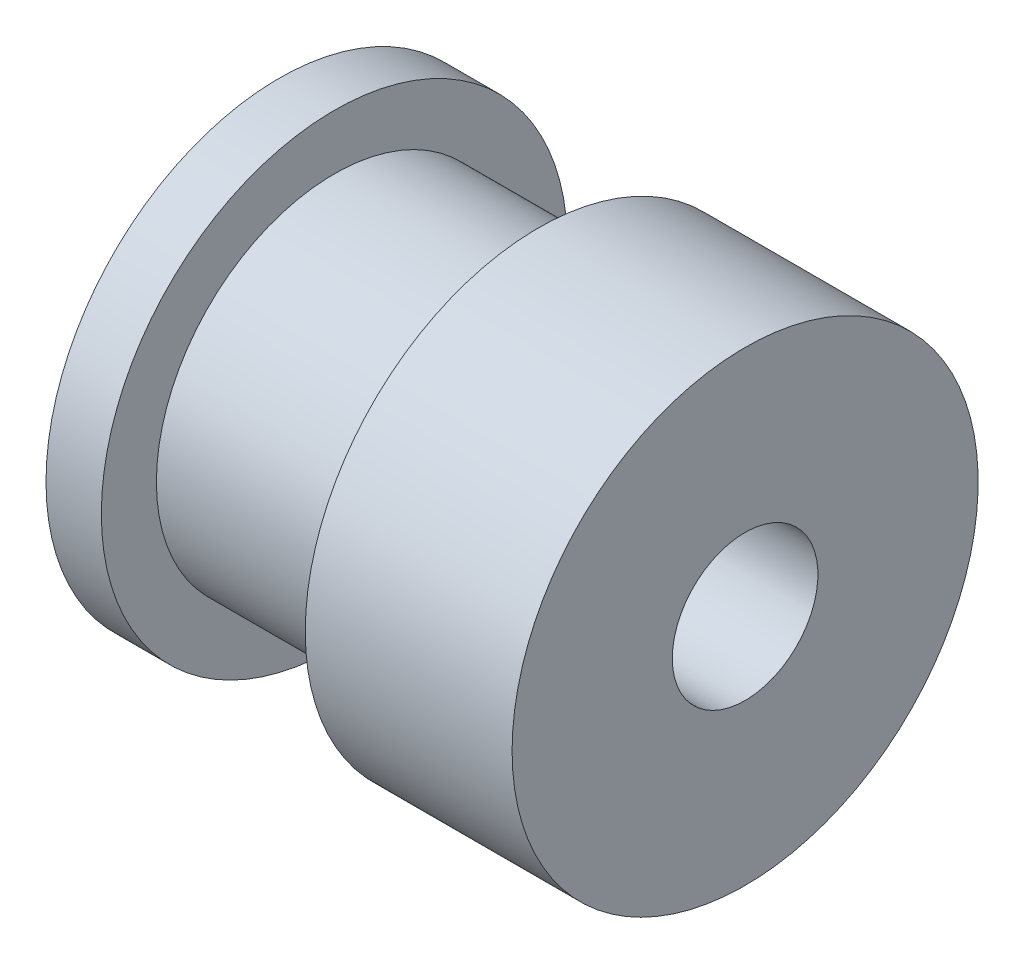
ISO-10303-21;
HEADER;
FILE_DESCRIPTION(('STEP AP214'),'2;1');
FILE_NAME('part.step','',(''),(''),'','','');
FILE_SCHEMA(('AUTOMOTIVE_DESIGN { 1 0 10303 214 1 1 1 1 }'));
ENDSEC;
DATA;
#1=APPLICATION_CONTEXT('core data for automotive mechanical design processes');
#2=APPLICATION_PROTOCOL_DEFINITION('international standard','automotive_design',2000,#1);
#3=PRODUCT_CONTEXT('',#1,'mechanical');
#4=PRODUCT('Part','Part','',(#3));
#5=PRODUCT_RELATED_PRODUCT_CATEGORY('part','',(#4));
#6=PRODUCT_DEFINITION_FORMATION('','',#4);
#7=PRODUCT_DEFINITION_CONTEXT('part definition',#1,'design');
#8=PRODUCT_DEFINITION('design','',#6,#7);
#9=PRODUCT_DEFINITION_SHAPE('','',#8);
#10=(LENGTH_UNIT() NAMED_UNIT(*) SI_UNIT(.MILLI.,.METRE.));
#11=(NAMED_UNIT(*) PLANE_ANGLE_UNIT() SI_UNIT($,.RADIAN.));
#12=(NAMED_UNIT(*) SI_UNIT($,.STERADIAN.) SOLID_ANGLE_UNIT());
#13=UNCERTAINTY_MEASURE_WITH_UNIT(LENGTH_MEASURE(1.E-05),#10,'distance_accuracy_value','');
#14=(GEOMETRIC_REPRESENTATION_CONTEXT(3) GLOBAL_UNCERTAINTY_ASSIGNED_CONTEXT((#13)) GLOBAL_UNIT_ASSIGNED_CONTEXT((#10,
#11,#12)) REPRESENTATION_CONTEXT('',''));
#15=CARTESIAN_POINT('',(0.,0.,0.));
#16=DIRECTION('',(0.,0.,1.));
#17=DIRECTION('',(1.,0.,0.));
#18=AXIS2_PLACEMENT_3D('',#15,#16,#17);
#19=CARTESIAN_POINT('',(0.,0.,0.));
#20=DIRECTION('',(-1.,0.,0.));
#21=DIRECTION('',(0.,0.,1.));
#22=AXIS2_PLACEMENT_3D('',#19,#20,#21);
#23=CYLINDRICAL_SURFACE('',#22,6.11);
#24=CARTESIAN_POINT('',(8.9,0.,0.));
#25=DIRECTION('',(-1.,0.,0.));
#26=DIRECTION('',(0.,0.,1.));
#27=AXIS2_PLACEMENT_3D('',#24,#25,#26);
#28=CIRCLE('',#27,6.11);
#29=CARTESIAN_POINT('',(8.9,0.,6.11));
#30=VERTEX_POINT('',#29);
#31=EDGE_CURVE('E59',#30,#30,#28,.T.);
#32=ORIENTED_EDGE('',*,*,#31,.T.);
#33=EDGE_LOOP('',(#32));
#34=FACE_BOUND('',#33,.T.);
#35=CARTESIAN_POINT('',(1.9,0.,0.));
#36=DIRECTION('',(-1.,0.,0.));
#37=DIRECTION('',(0.,0.,1.));
#38=AXIS2_PLACEMENT_3D('',#35,#36,#37);
#39=CIRCLE('',#38,6.11);
#40=CARTESIAN_POINT('',(1.9,0.,6.11));
#41=VERTEX_POINT('',#40);
#42=EDGE_CURVE('E10',#41,#41,#39,.T.);
#43=ORIENTED_EDGE('',*,*,#42,.F.);
#44=EDGE_LOOP('',(#43));
#45=FACE_BOUND('',#44,.T.);
#46=ADVANCED_FACE('F31',(#34,#45),#23,.T.);
#47=CARTESIAN_POINT('',(1.9,-8.,0.));
#48=DIRECTION('',(1.,0.,0.));
#49=DIRECTION('',(0.,0.,-1.));
#50=AXIS2_PLACEMENT_3D('',#47,#48,#49);
#51=PLANE('',#50);
#52=ORIENTED_EDGE('',*,*,#42,.T.);
#53=EDGE_LOOP('',(#52));
#54=FACE_BOUND('',#53,.T.);
#55=CARTESIAN_POINT('',(1.9,0.,0.));
#56=DIRECTION('',(-1.,0.,0.));
#57=DIRECTION('',(0.,0.,1.));
#58=AXIS2_PLACEMENT_3D('',#55,#56,#57);
#59=CIRCLE('',#58,8.);
#60=CARTESIAN_POINT('',(1.9,0.,8.));
#61=VERTEX_POINT('',#60);
#62=EDGE_CURVE('E37',#61,#61,#59,.T.);
#63=ORIENTED_EDGE('',*,*,#62,.F.);
#64=EDGE_LOOP('',(#63));
#65=FACE_BOUND('',#64,.T.);
#66=ADVANCED_FACE('F77',(#54,#65),#51,.T.);
#67=CARTESIAN_POINT('',(0.,0.,0.));
#68=DIRECTION('',(-1.,0.,0.));
#69=DIRECTION('',(0.,0.,1.));
#70=AXIS2_PLACEMENT_3D('',#67,#68,#69);
#71=CYLINDRICAL_SURFACE('',#70,8.);
#72=ORIENTED_EDGE('',*,*,#62,.T.);
#73=EDGE_LOOP('',(#72));
#74=FACE_BOUND('',#73,.T.);
#75=CARTESIAN_POINT('',(0.,0.,0.));
#76=DIRECTION('',(-1.,0.,0.));
#77=DIRECTION('',(0.,0.,1.));
#78=AXIS2_PLACEMENT_3D('',#75,#76,#77);
#79=CIRCLE('',#78,8.);
#80=CARTESIAN_POINT('',(0.,0.,8.));
#81=VERTEX_POINT('',#80);
#82=EDGE_CURVE('E41',#81,#81,#79,.T.);
#83=ORIENTED_EDGE('',*,*,#82,.F.);
#84=EDGE_LOOP('',(#83));
#85=FACE_BOUND('',#84,.T.);
#86=ADVANCED_FACE('F81',(#74,#85),#71,.T.);
#87=CARTESIAN_POINT('',(0.,-2.5,0.));
#88=DIRECTION('',(-1.,0.,0.));
#89=DIRECTION('',(0.,0.,1.));
#90=AXIS2_PLACEMENT_3D('',#87,#88,#89);
#91=PLANE('',#90);
#92=ORIENTED_EDGE('',*,*,#82,.T.);
#93=EDGE_LOOP('',(#92));
#94=FACE_BOUND('',#93,.T.);
#95=CARTESIAN_POINT('',(0.,0.,0.));
#96=DIRECTION('',(-1.,0.,0.));
#97=DIRECTION('',(0.,0.,1.));
#98=AXIS2_PLACEMENT_3D('',#95,#96,#97);
#99=CIRCLE('',#98,2.5);
#100=CARTESIAN_POINT('',(0.,0.,2.5));
#101=VERTEX_POINT('',#100);
#102=EDGE_CURVE('E45',#101,#101,#99,.T.);
#103=ORIENTED_EDGE('',*,*,#102,.F.);
#104=EDGE_LOOP('',(#103));
#105=FACE_BOUND('',#104,.T.);
#106=ADVANCED_FACE('F85',(#94,#105),#91,.T.);
#107=CARTESIAN_POINT('',(0.,0.,0.));
#108=DIRECTION('',(-1.,0.,0.));
#109=DIRECTION('',(0.,0.,1.));
#110=AXIS2_PLACEMENT_3D('',#107,#108,#109);
#111=CYLINDRICAL_SURFACE('',#110,2.5);
#112=ORIENTED_EDGE('',*,*,#102,.T.);
#113=EDGE_LOOP('',(#112));
#114=FACE_BOUND('',#113,.T.);
#115=CARTESIAN_POINT('',(16.,0.,0.));
#116=DIRECTION('',(-1.,0.,0.));
#117=DIRECTION('',(0.,0.,1.));
#118=AXIS2_PLACEMENT_3D('',#115,#116,#117);
#119=CIRCLE('',#118,2.5);
#120=CARTESIAN_POINT('',(16.,0.,2.5));
#121=VERTEX_POINT('',#120);
#122=EDGE_CURVE('E50',#121,#121,#119,.T.);
#123=ORIENTED_EDGE('',*,*,#122,.F.);
#124=EDGE_LOOP('',(#123));
#125=FACE_BOUND('',#124,.T.);
#126=ADVANCED_FACE('F91',(#114,#125),#111,.F.);
#127=CARTESIAN_POINT('',(16.,-2.5,0.));
#128=DIRECTION('',(1.,0.,0.));
#129=DIRECTION('',(0.,0.,-1.));
#130=AXIS2_PLACEMENT_3D('',#127,#128,#129);
#131=PLANE('',#130);
#132=ORIENTED_EDGE('',*,*,#122,.T.);
#133=EDGE_LOOP('',(#132));
#134=FACE_BOUND('',#133,.T.);
#135=CARTESIAN_POINT('',(16.,0.,0.));
#136=DIRECTION('',(-1.,0.,0.));
#137=DIRECTION('',(0.,0.,1.));
#138=AXIS2_PLACEMENT_3D('',#135,#136,#137);
#139=CIRCLE('',#138,8.);
#140=CARTESIAN_POINT('',(16.,0.,8.));
#141=VERTEX_POINT('',#140);
#142=EDGE_CURVE('E53',#141,#141,#139,.T.);
#143=ORIENTED_EDGE('',*,*,#142,.F.);
#144=EDGE_LOOP('',(#143));
#145=FACE_BOUND('',#144,.T.);
#146=ADVANCED_FACE('F73',(#134,#145),#131,.T.);
#147=CARTESIAN_POINT('',(0.,0.,0.));
#148=DIRECTION('',(-1.,0.,0.));
#149=DIRECTION('',(0.,0.,1.));
#150=AXIS2_PLACEMENT_3D('',#147,#148,#149);
#151=CYLINDRICAL_SURFACE('',#150,8.);
#152=ORIENTED_EDGE('',*,*,#142,.T.);
#153=EDGE_LOOP('',(#152));
#154=FACE_BOUND('',#153,.T.);
#155=CARTESIAN_POINT('',(8.9,0.,0.));
#156=DIRECTION('',(-1.,0.,0.));
#157=DIRECTION('',(0.,0.,1.));
#158=AXIS2_PLACEMENT_3D('',#155,#156,#157);
#159=CIRCLE('',#158,8.);
#160=CARTESIAN_POINT('',(8.9,0.,8.));
#161=VERTEX_POINT('',#160);
#162=EDGE_CURVE('E56',#161,#161,#159,.T.);
#163=ORIENTED_EDGE('',*,*,#162,.F.);
#164=EDGE_LOOP('',(#163));
#165=FACE_BOUND('',#164,.T.);
#166=ADVANCED_FACE('F67',(#154,#165),#151,.T.);
#167=CARTESIAN_POINT('',(8.9,-6.11,0.));
#168=DIRECTION('',(-1.,0.,0.));
#169=DIRECTION('',(0.,0.,1.));
#170=AXIS2_PLACEMENT_3D('',#167,#168,#169);
#171=PLANE('',#170);
#172=ORIENTED_EDGE('',*,*,#162,.T.);
#173=EDGE_LOOP('',(#172));
#174=FACE_BOUND('',#173,.T.);
#175=ORIENTED_EDGE('',*,*,#31,.F.);
#176=EDGE_LOOP('',(#175));
#177=FACE_BOUND('',#176,.T.);
#178=ADVANCED_FACE('F65',(#174,#177),#171,.T.);
#179=CLOSED_SHELL('',(#46,#66,#86,#106,#126,#146,#166,#178));
#180=MANIFOLD_SOLID_BREP('B2',#179);
#181=ADVANCED_BREP_SHAPE_REPRESENTATION('',(#18,#180),#14);
#182=SHAPE_DEFINITION_REPRESENTATION(#9,#181);
ENDSEC;
END-ISO-10303-21;
